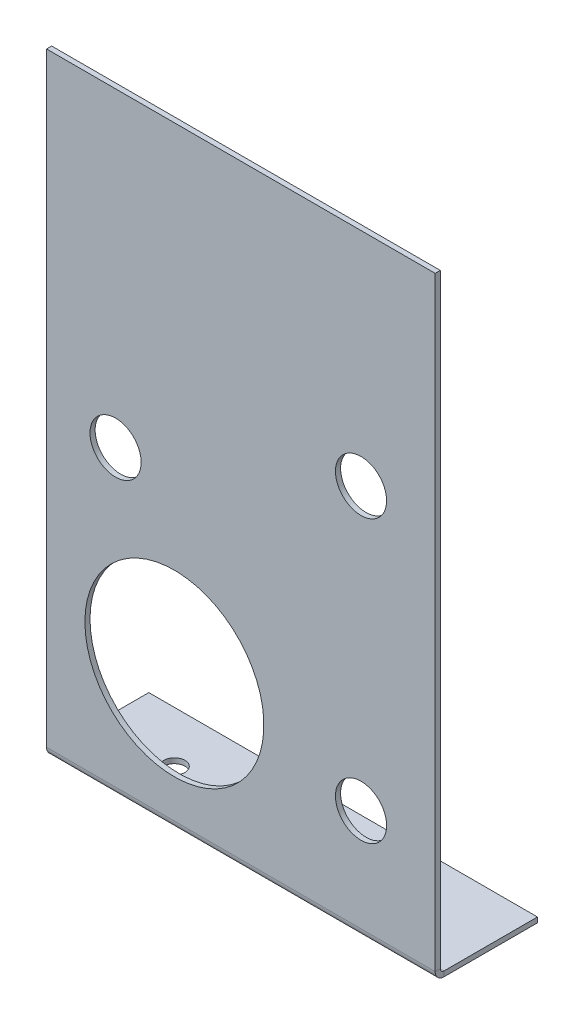
ISO-10303-21;
HEADER;
FILE_DESCRIPTION(('STEP AP214'),'2;1');
FILE_NAME('part.step','',(''),(''),'','','');
FILE_SCHEMA(('AUTOMOTIVE_DESIGN { 1 0 10303 214 1 1 1 1 }'));
ENDSEC;
DATA;
#1=APPLICATION_CONTEXT('core data for automotive mechanical design processes');
#2=APPLICATION_PROTOCOL_DEFINITION('international standard','automotive_design',2000,#1);
#3=PRODUCT_CONTEXT('',#1,'mechanical');
#4=PRODUCT('Part','Part','',(#3));
#5=PRODUCT_RELATED_PRODUCT_CATEGORY('part','',(#4));
#6=PRODUCT_DEFINITION_FORMATION('','',#4);
#7=PRODUCT_DEFINITION_CONTEXT('part definition',#1,'design');
#8=PRODUCT_DEFINITION('design','',#6,#7);
#9=PRODUCT_DEFINITION_SHAPE('','',#8);
#10=(LENGTH_UNIT() NAMED_UNIT(*) SI_UNIT(.MILLI.,.METRE.));
#11=(NAMED_UNIT(*) PLANE_ANGLE_UNIT() SI_UNIT($,.RADIAN.));
#12=(NAMED_UNIT(*) SI_UNIT($,.STERADIAN.) SOLID_ANGLE_UNIT());
#13=UNCERTAINTY_MEASURE_WITH_UNIT(LENGTH_MEASURE(1.E-05),#10,'distance_accuracy_value','');
#14=(GEOMETRIC_REPRESENTATION_CONTEXT(3) GLOBAL_UNCERTAINTY_ASSIGNED_CONTEXT((#13)) GLOBAL_UNIT_ASSIGNED_CONTEXT((#10,
#11,#12)) REPRESENTATION_CONTEXT('',''));
#15=CARTESIAN_POINT('',(0.,0.,0.));
#16=DIRECTION('',(0.,0.,1.));
#17=DIRECTION('',(1.,0.,0.));
#18=AXIS2_PLACEMENT_3D('',#15,#16,#17);
#19=CARTESIAN_POINT('',(-38.,-60.,-1.));
#20=DIRECTION('',(-1.,0.,0.));
#21=DIRECTION('',(0.,0.,1.));
#22=AXIS2_PLACEMENT_3D('',#19,#20,#21);
#23=PLANE('',#22);
#24=DIRECTION('',(0.,-1.,0.));
#25=VECTOR('',#24,1.);
#26=CARTESIAN_POINT('',(-38.,-60.,-1.));
#27=LINE('',#26,#25);
#28=CARTESIAN_POINT('',(-38.,60.,-1.));
#29=VERTEX_POINT('',#28);
#30=CARTESIAN_POINT('',(-38.,-58.2634,-1.));
#31=VERTEX_POINT('',#30);
#32=EDGE_CURVE('E242',#29,#31,#27,.T.);
#33=ORIENTED_EDGE('',*,*,#32,.T.);
#34=DIRECTION('',(0.,0.,1.));
#35=VECTOR('',#34,1.);
#36=CARTESIAN_POINT('',(-38.,-58.2634,-1.));
#37=LINE('',#36,#35);
#38=CARTESIAN_POINT('',(-38.,-58.2634,0.));
#39=VERTEX_POINT('',#38);
#40=EDGE_CURVE('E215',#31,#39,#37,.T.);
#41=ORIENTED_EDGE('',*,*,#40,.T.);
#42=DIRECTION('',(0.,-1.,0.));
#43=VECTOR('',#42,1.);
#44=CARTESIAN_POINT('',(-38.,-60.,0.));
#45=LINE('',#44,#43);
#46=CARTESIAN_POINT('',(-38.,60.,0.));
#47=VERTEX_POINT('',#46);
#48=EDGE_CURVE('E238',#47,#39,#45,.T.);
#49=ORIENTED_EDGE('',*,*,#48,.F.);
#50=DIRECTION('',(0.,0.,1.));
#51=VECTOR('',#50,1.);
#52=CARTESIAN_POINT('',(-38.,60.,-1.));
#53=LINE('',#52,#51);
#54=EDGE_CURVE('E14',#29,#47,#53,.T.);
#55=ORIENTED_EDGE('',*,*,#54,.F.);
#56=EDGE_LOOP('',(#33,#41,#49,#55));
#57=FACE_BOUND('',#56,.T.);
#58=ADVANCED_FACE('F70',(#57),#23,.T.);
#59=CARTESIAN_POINT('',(0.,0.,-1.));
#60=DIRECTION('',(0.,0.,-1.));
#61=DIRECTION('',(-1.,0.,0.));
#62=AXIS2_PLACEMENT_3D('',#59,#60,#61);
#63=PLANE('',#62);
#64=CARTESIAN_POINT('',(23.5,16.7366,-1.));
#65=DIRECTION('',(0.,0.,-1.));
#66=DIRECTION('',(-1.,0.,0.));
#67=AXIS2_PLACEMENT_3D('',#64,#65,#66);
#68=CIRCLE('',#67,5.);
#69=CARTESIAN_POINT('',(18.5,16.7366,-1.));
#70=VERTEX_POINT('',#69);
#71=EDGE_CURVE('E359',#70,#70,#68,.T.);
#72=ORIENTED_EDGE('',*,*,#71,.F.);
#73=EDGE_LOOP('',(#72));
#74=FACE_BOUND('',#73,.T.);
#75=CARTESIAN_POINT('',(-24.5,-0.763399999999977,-1.));
#76=DIRECTION('',(0.,0.,-1.));
#77=DIRECTION('',(-1.,0.,0.));
#78=AXIS2_PLACEMENT_3D('',#75,#76,#77);
#79=CIRCLE('',#78,5.);
#80=CARTESIAN_POINT('',(-29.5,-0.763399999999977,-1.));
#81=VERTEX_POINT('',#80);
#82=EDGE_CURVE('E365',#81,#81,#79,.T.);
#83=ORIENTED_EDGE('',*,*,#82,.F.);
#84=EDGE_LOOP('',(#83));
#85=FACE_BOUND('',#84,.T.);
#86=CARTESIAN_POINT('',(-13.,-33.2634,-1.));
#87=DIRECTION('',(0.,0.,-1.));
#88=DIRECTION('',(-1.,0.,0.));
#89=AXIS2_PLACEMENT_3D('',#86,#87,#88);
#90=CIRCLE('',#89,17.5);
#91=CARTESIAN_POINT('',(-30.5,-33.2634,-1.));
#92=VERTEX_POINT('',#91);
#93=EDGE_CURVE('E371',#92,#92,#90,.T.);
#94=ORIENTED_EDGE('',*,*,#93,.F.);
#95=EDGE_LOOP('',(#94));
#96=FACE_BOUND('',#95,.T.);
#97=CARTESIAN_POINT('',(23.5,-38.2634,-1.));
#98=DIRECTION('',(0.,0.,-1.));
#99=DIRECTION('',(-1.,0.,0.));
#100=AXIS2_PLACEMENT_3D('',#97,#98,#99);
#101=CIRCLE('',#100,5.);
#102=CARTESIAN_POINT('',(18.5,-38.2634,-1.));
#103=VERTEX_POINT('',#102);
#104=EDGE_CURVE('E287',#103,#103,#101,.T.);
#105=ORIENTED_EDGE('',*,*,#104,.F.);
#106=EDGE_LOOP('',(#105));
#107=FACE_BOUND('',#106,.T.);
#108=DIRECTION('',(0.,1.,0.));
#109=VECTOR('',#108,1.);
#110=CARTESIAN_POINT('',(38.,-60.,-1.));
#111=LINE('',#110,#109);
#112=CARTESIAN_POINT('',(38.,-58.2634,-1.));
#113=VERTEX_POINT('',#112);
#114=CARTESIAN_POINT('',(38.,60.,-1.));
#115=VERTEX_POINT('',#114);
#116=EDGE_CURVE('E234',#113,#115,#111,.T.);
#117=ORIENTED_EDGE('',*,*,#116,.F.);
#118=DIRECTION('',(-1.,0.,0.));
#119=VECTOR('',#118,1.);
#120=CARTESIAN_POINT('',(-38.,-58.2634,-1.));
#121=LINE('',#120,#119);
#122=EDGE_CURVE('E89',#31,#113,#121,.F.);
#123=ORIENTED_EDGE('',*,*,#122,.F.);
#124=ORIENTED_EDGE('',*,*,#32,.F.);
#125=DIRECTION('',(-1.,0.,0.));
#126=VECTOR('',#125,1.);
#127=CARTESIAN_POINT('',(-38.,60.,-1.));
#128=LINE('',#127,#126);
#129=EDGE_CURVE('E237',#115,#29,#128,.T.);
#130=ORIENTED_EDGE('',*,*,#129,.F.);
#131=EDGE_LOOP('',(#117,#123,#124,#130));
#132=FACE_BOUND('',#131,.T.);
#133=ADVANCED_FACE('F327',(#74,#85,#96,#107,#132),#63,.T.);
#134=CARTESIAN_POINT('',(0.,0.,0.));
#135=DIRECTION('',(0.,0.,-1.));
#136=DIRECTION('',(-1.,0.,0.));
#137=AXIS2_PLACEMENT_3D('',#134,#135,#136);
#138=PLANE('',#137);
#139=CARTESIAN_POINT('',(23.5,16.7366,0.));
#140=DIRECTION('',(0.,0.,-1.));
#141=DIRECTION('',(-1.,0.,0.));
#142=AXIS2_PLACEMENT_3D('',#139,#140,#141);
#143=CIRCLE('',#142,5.);
#144=CARTESIAN_POINT('',(18.5,16.7366,0.));
#145=VERTEX_POINT('',#144);
#146=EDGE_CURVE('E343',#145,#145,#143,.T.);
#147=ORIENTED_EDGE('',*,*,#146,.T.);
#148=EDGE_LOOP('',(#147));
#149=FACE_BOUND('',#148,.T.);
#150=CARTESIAN_POINT('',(-24.5,-0.763399999999977,0.));
#151=DIRECTION('',(0.,0.,-1.));
#152=DIRECTION('',(-1.,0.,0.));
#153=AXIS2_PLACEMENT_3D('',#150,#151,#152);
#154=CIRCLE('',#153,5.);
#155=CARTESIAN_POINT('',(-29.5,-0.763399999999977,0.));
#156=VERTEX_POINT('',#155);
#157=EDGE_CURVE('E347',#156,#156,#154,.T.);
#158=ORIENTED_EDGE('',*,*,#157,.T.);
#159=EDGE_LOOP('',(#158));
#160=FACE_BOUND('',#159,.T.);
#161=CARTESIAN_POINT('',(-13.,-33.2634,0.));
#162=DIRECTION('',(0.,0.,-1.));
#163=DIRECTION('',(-1.,0.,0.));
#164=AXIS2_PLACEMENT_3D('',#161,#162,#163);
#165=CIRCLE('',#164,17.5);
#166=CARTESIAN_POINT('',(-30.5,-33.2634,0.));
#167=VERTEX_POINT('',#166);
#168=EDGE_CURVE('E351',#167,#167,#165,.T.);
#169=ORIENTED_EDGE('',*,*,#168,.T.);
#170=EDGE_LOOP('',(#169));
#171=FACE_BOUND('',#170,.T.);
#172=CARTESIAN_POINT('',(23.5,-38.2634,0.));
#173=DIRECTION('',(0.,0.,-1.));
#174=DIRECTION('',(-1.,0.,0.));
#175=AXIS2_PLACEMENT_3D('',#172,#173,#174);
#176=CIRCLE('',#175,5.);
#177=CARTESIAN_POINT('',(18.5,-38.2634,0.));
#178=VERTEX_POINT('',#177);
#179=EDGE_CURVE('E277',#178,#178,#176,.T.);
#180=ORIENTED_EDGE('',*,*,#179,.T.);
#181=EDGE_LOOP('',(#180));
#182=FACE_BOUND('',#181,.T.);
#183=DIRECTION('',(-1.,0.,0.));
#184=VECTOR('',#183,1.);
#185=CARTESIAN_POINT('',(-38.,-58.2634,0.));
#186=LINE('',#185,#184);
#187=CARTESIAN_POINT('',(38.,-58.2634,0.));
#188=VERTEX_POINT('',#187);
#189=EDGE_CURVE('E207',#39,#188,#186,.F.);
#190=ORIENTED_EDGE('',*,*,#189,.T.);
#191=DIRECTION('',(0.,1.,0.));
#192=VECTOR('',#191,1.);
#193=CARTESIAN_POINT('',(38.,-60.,0.));
#194=LINE('',#193,#192);
#195=CARTESIAN_POINT('',(38.,60.,0.));
#196=VERTEX_POINT('',#195);
#197=EDGE_CURVE('E231',#188,#196,#194,.T.);
#198=ORIENTED_EDGE('',*,*,#197,.T.);
#199=DIRECTION('',(-1.,0.,0.));
#200=VECTOR('',#199,1.);
#201=CARTESIAN_POINT('',(-38.,60.,0.));
#202=LINE('',#201,#200);
#203=EDGE_CURVE('E247',#196,#47,#202,.T.);
#204=ORIENTED_EDGE('',*,*,#203,.T.);
#205=ORIENTED_EDGE('',*,*,#48,.T.);
#206=EDGE_LOOP('',(#190,#198,#204,#205));
#207=FACE_BOUND('',#206,.T.);
#208=ADVANCED_FACE('F256',(#149,#160,#171,#182,#207),#138,.F.);
#209=CARTESIAN_POINT('',(38.,-60.,-1.));
#210=DIRECTION('',(1.,0.,0.));
#211=DIRECTION('',(0.,0.,-1.));
#212=AXIS2_PLACEMENT_3D('',#209,#210,#211);
#213=PLANE('',#212);
#214=DIRECTION('',(0.,0.,1.));
#215=VECTOR('',#214,1.);
#216=CARTESIAN_POINT('',(38.,-58.2634,-1.));
#217=LINE('',#216,#215);
#218=EDGE_CURVE('E98',#113,#188,#217,.T.);
#219=ORIENTED_EDGE('',*,*,#218,.F.);
#220=ORIENTED_EDGE('',*,*,#116,.T.);
#221=DIRECTION('',(0.,0.,1.));
#222=VECTOR('',#221,1.);
#223=CARTESIAN_POINT('',(38.,60.,-1.));
#224=LINE('',#223,#222);
#225=EDGE_CURVE('E74',#115,#196,#224,.T.);
#226=ORIENTED_EDGE('',*,*,#225,.T.);
#227=ORIENTED_EDGE('',*,*,#197,.F.);
#228=EDGE_LOOP('',(#219,#220,#226,#227));
#229=FACE_BOUND('',#228,.T.);
#230=ADVANCED_FACE('F72',(#229),#213,.T.);
#231=CARTESIAN_POINT('',(-38.,60.,-1.));
#232=DIRECTION('',(0.,1.,0.));
#233=DIRECTION('',(0.,0.,1.));
#234=AXIS2_PLACEMENT_3D('',#231,#232,#233);
#235=PLANE('',#234);
#236=ORIENTED_EDGE('',*,*,#203,.F.);
#237=ORIENTED_EDGE('',*,*,#225,.F.);
#238=ORIENTED_EDGE('',*,*,#129,.T.);
#239=ORIENTED_EDGE('',*,*,#54,.T.);
#240=EDGE_LOOP('',(#236,#237,#238,#239));
#241=FACE_BOUND('',#240,.T.);
#242=ADVANCED_FACE('F317',(#241),#235,.T.);
#243=CARTESIAN_POINT('',(38.,-58.2634,-1.7366));
#244=DIRECTION('',(1.,0.,0.));
#245=DIRECTION('',(0.,0.,-1.));
#246=AXIS2_PLACEMENT_3D('',#243,#244,#245);
#247=PLANE('',#246);
#248=DIRECTION('',(0.,1.,0.));
#249=VECTOR('',#248,1.);
#250=CARTESIAN_POINT('',(38.,-60.,-1.73659999999999));
#251=LINE('',#250,#249);
#252=CARTESIAN_POINT('',(38.,-59.,-1.7366));
#253=VERTEX_POINT('',#252);
#254=CARTESIAN_POINT('',(37.9999999999999,-60.,-1.73659999999999));
#255=VERTEX_POINT('',#254);
#256=EDGE_CURVE('E179',#253,#255,#251,.F.);
#257=ORIENTED_EDGE('',*,*,#256,.F.);
#258=CARTESIAN_POINT('',(38.,-58.2634,-1.7366));
#259=DIRECTION('',(-1.,0.,0.));
#260=DIRECTION('',(0.,0.,1.));
#261=AXIS2_PLACEMENT_3D('',#258,#259,#260);
#262=CIRCLE('',#261,0.736599999999997);
#263=EDGE_CURVE('E219',#113,#253,#262,.F.);
#264=ORIENTED_EDGE('',*,*,#263,.F.);
#265=ORIENTED_EDGE('',*,*,#218,.T.);
#266=CARTESIAN_POINT('',(37.9999999999999,-58.2634,-1.7366));
#267=DIRECTION('',(-1.,0.,0.));
#268=DIRECTION('',(0.,0.,1.));
#269=AXIS2_PLACEMENT_3D('',#266,#267,#268);
#270=CIRCLE('',#269,1.7366);
#271=EDGE_CURVE('E210',#188,#255,#270,.F.);
#272=ORIENTED_EDGE('',*,*,#271,.T.);
#273=EDGE_LOOP('',(#257,#264,#265,#272));
#274=FACE_BOUND('',#273,.T.);
#275=ADVANCED_FACE('F315',(#274),#247,.T.);
#276=CARTESIAN_POINT('',(-38.,-58.2634,-1.7366));
#277=DIRECTION('',(1.,0.,0.));
#278=DIRECTION('',(0.,0.,-1.));
#279=AXIS2_PLACEMENT_3D('',#276,#277,#278);
#280=PLANE('',#279);
#281=CARTESIAN_POINT('',(-38.,-58.2634,-1.7366));
#282=DIRECTION('',(-1.,0.,0.));
#283=DIRECTION('',(0.,0.,1.));
#284=AXIS2_PLACEMENT_3D('',#281,#282,#283);
#285=CIRCLE('',#284,0.736599999999997);
#286=CARTESIAN_POINT('',(-38.,-59.,-1.7366));
#287=VERTEX_POINT('',#286);
#288=EDGE_CURVE('E225',#287,#31,#285,.T.);
#289=ORIENTED_EDGE('',*,*,#288,.F.);
#290=DIRECTION('',(0.,1.,0.));
#291=VECTOR('',#290,1.);
#292=CARTESIAN_POINT('',(-38.,-59.,-1.7366));
#293=LINE('',#292,#291);
#294=CARTESIAN_POINT('',(-38.,-60.,-1.73659999999999));
#295=VERTEX_POINT('',#294);
#296=EDGE_CURVE('E197',#287,#295,#293,.F.);
#297=ORIENTED_EDGE('',*,*,#296,.T.);
#298=CARTESIAN_POINT('',(-38.,-58.2634,-1.7366));
#299=DIRECTION('',(-1.,0.,0.));
#300=DIRECTION('',(0.,0.,1.));
#301=AXIS2_PLACEMENT_3D('',#298,#299,#300);
#302=CIRCLE('',#301,1.7366);
#303=EDGE_CURVE('E211',#295,#39,#302,.T.);
#304=ORIENTED_EDGE('',*,*,#303,.T.);
#305=ORIENTED_EDGE('',*,*,#40,.F.);
#306=EDGE_LOOP('',(#289,#297,#304,#305));
#307=FACE_BOUND('',#306,.T.);
#308=ADVANCED_FACE('F265',(#307),#280,.F.);
#309=CARTESIAN_POINT('',(-38.,-58.2634,-1.7366));
#310=DIRECTION('',(-1.,0.,0.));
#311=DIRECTION('',(0.,-1.,0.));
#312=AXIS2_PLACEMENT_3D('',#309,#310,#311);
#313=CYLINDRICAL_SURFACE('',#312,1.7366);
#314=ORIENTED_EDGE('',*,*,#189,.F.);
#315=ORIENTED_EDGE('',*,*,#303,.F.);
#316=DIRECTION('',(-1.,0.,0.));
#317=VECTOR('',#316,1.);
#318=CARTESIAN_POINT('',(38.,-60.,-1.73659999999999));
#319=LINE('',#318,#317);
#320=EDGE_CURVE('E194',#295,#255,#319,.F.);
#321=ORIENTED_EDGE('',*,*,#320,.T.);
#322=ORIENTED_EDGE('',*,*,#271,.F.);
#323=EDGE_LOOP('',(#314,#315,#321,#322));
#324=FACE_BOUND('',#323,.T.);
#325=ADVANCED_FACE('F261',(#324),#313,.T.);
#326=CARTESIAN_POINT('',(-38.,-58.2634,-1.7366));
#327=DIRECTION('',(-1.,0.,0.));
#328=DIRECTION('',(0.,-1.,0.));
#329=AXIS2_PLACEMENT_3D('',#326,#327,#328);
#330=CYLINDRICAL_SURFACE('',#329,0.736599999999997);
#331=ORIENTED_EDGE('',*,*,#122,.T.);
#332=ORIENTED_EDGE('',*,*,#263,.T.);
#333=DIRECTION('',(-1.,0.,0.));
#334=VECTOR('',#333,1.);
#335=CARTESIAN_POINT('',(38.,-59.,-1.7366));
#336=LINE('',#335,#334);
#337=EDGE_CURVE('E201',#253,#287,#336,.T.);
#338=ORIENTED_EDGE('',*,*,#337,.T.);
#339=ORIENTED_EDGE('',*,*,#288,.T.);
#340=EDGE_LOOP('',(#331,#332,#338,#339));
#341=FACE_BOUND('',#340,.T.);
#342=ADVANCED_FACE('F312',(#341),#330,.F.);
#343=CARTESIAN_POINT('',(-38.,-60.,-20.));
#344=DIRECTION('',(1.,0.,0.));
#345=DIRECTION('',(0.,0.,-1.));
#346=AXIS2_PLACEMENT_3D('',#343,#344,#345);
#347=PLANE('',#346);
#348=ORIENTED_EDGE('',*,*,#296,.F.);
#349=DIRECTION('',(0.,0.,1.));
#350=VECTOR('',#349,1.);
#351=CARTESIAN_POINT('',(-38.,-59.,-20.));
#352=LINE('',#351,#350);
#353=CARTESIAN_POINT('',(-38.,-59.,-20.));
#354=VERTEX_POINT('',#353);
#355=EDGE_CURVE('E191',#287,#354,#352,.F.);
#356=ORIENTED_EDGE('',*,*,#355,.T.);
#357=DIRECTION('',(0.,1.,0.));
#358=VECTOR('',#357,1.);
#359=CARTESIAN_POINT('',(-38.,-60.,-20.));
#360=LINE('',#359,#358);
#361=CARTESIAN_POINT('',(-38.,-60.,-20.));
#362=VERTEX_POINT('',#361);
#363=EDGE_CURVE('E175',#362,#354,#360,.T.);
#364=ORIENTED_EDGE('',*,*,#363,.F.);
#365=DIRECTION('',(0.,0.,-1.));
#366=VECTOR('',#365,1.);
#367=CARTESIAN_POINT('',(-38.,-60.,2.08736658917573E-13));
#368=LINE('',#367,#366);
#369=EDGE_CURVE('E160',#295,#362,#368,.T.);
#370=ORIENTED_EDGE('',*,*,#369,.F.);
#371=EDGE_LOOP('',(#348,#356,#364,#370));
#372=FACE_BOUND('',#371,.T.);
#373=ADVANCED_FACE('F269',(#372),#347,.F.);
#374=CARTESIAN_POINT('',(38.,-60.,-0.999999999999997));
#375=DIRECTION('',(-1.,0.,0.));
#376=DIRECTION('',(0.,0.,1.));
#377=AXIS2_PLACEMENT_3D('',#374,#375,#376);
#378=PLANE('',#377);
#379=ORIENTED_EDGE('',*,*,#256,.T.);
#380=DIRECTION('',(0.,0.,1.));
#381=VECTOR('',#380,1.);
#382=CARTESIAN_POINT('',(38.,-60.,2.36492234533202E-13));
#383=LINE('',#382,#381);
#384=CARTESIAN_POINT('',(38.,-60.,-20.));
#385=VERTEX_POINT('',#384);
#386=EDGE_CURVE('E158',#385,#255,#383,.T.);
#387=ORIENTED_EDGE('',*,*,#386,.F.);
#388=DIRECTION('',(0.,1.,0.));
#389=VECTOR('',#388,1.);
#390=CARTESIAN_POINT('',(38.,-60.,-20.));
#391=LINE('',#390,#389);
#392=CARTESIAN_POINT('',(38.,-59.,-20.));
#393=VERTEX_POINT('',#392);
#394=EDGE_CURVE('E167',#385,#393,#391,.T.);
#395=ORIENTED_EDGE('',*,*,#394,.T.);
#396=DIRECTION('',(0.,0.,-1.));
#397=VECTOR('',#396,1.);
#398=CARTESIAN_POINT('',(38.,-59.,-1.));
#399=LINE('',#398,#397);
#400=EDGE_CURVE('E186',#393,#253,#399,.F.);
#401=ORIENTED_EDGE('',*,*,#400,.T.);
#402=EDGE_LOOP('',(#379,#387,#395,#401));
#403=FACE_BOUND('',#402,.T.);
#404=ADVANCED_FACE('F178',(#403),#378,.F.);
#405=CARTESIAN_POINT('',(0.,-60.,2.22614446725387E-13));
#406=DIRECTION('',(0.,1.,0.));
#407=DIRECTION('',(0.,0.,1.));
#408=AXIS2_PLACEMENT_3D('',#405,#406,#407);
#409=PLANE('',#408);
#410=CARTESIAN_POINT('',(-23.,-60.,-9.99999999999997));
#411=DIRECTION('',(0.,1.,0.));
#412=DIRECTION('',(0.,0.,1.));
#413=AXIS2_PLACEMENT_3D('',#410,#411,#412);
#414=CIRCLE('',#413,2.06399442875174);
#415=CARTESIAN_POINT('',(-23.,-60.,-7.93600557124823));
#416=VERTEX_POINT('',#415);
#417=EDGE_CURVE('E206',#416,#416,#414,.T.);
#418=ORIENTED_EDGE('',*,*,#417,.T.);
#419=EDGE_LOOP('',(#418));
#420=FACE_BOUND('',#419,.T.);
#421=CARTESIAN_POINT('',(23.,-60.,-9.99999999999997));
#422=DIRECTION('',(0.,1.,0.));
#423=DIRECTION('',(0.,0.,1.));
#424=AXIS2_PLACEMENT_3D('',#421,#422,#423);
#425=CIRCLE('',#424,2.06399442875174);
#426=CARTESIAN_POINT('',(23.,-60.,-7.93600557124823));
#427=VERTEX_POINT('',#426);
#428=EDGE_CURVE('E276',#427,#427,#425,.T.);
#429=ORIENTED_EDGE('',*,*,#428,.T.);
#430=EDGE_LOOP('',(#429));
#431=FACE_BOUND('',#430,.T.);
#432=ORIENTED_EDGE('',*,*,#320,.F.);
#433=ORIENTED_EDGE('',*,*,#369,.T.);
#434=DIRECTION('',(1.,0.,0.));
#435=VECTOR('',#434,1.);
#436=CARTESIAN_POINT('',(0.,-60.,-20.));
#437=LINE('',#436,#435);
#438=EDGE_CURVE('E153',#362,#385,#437,.T.);
#439=ORIENTED_EDGE('',*,*,#438,.T.);
#440=ORIENTED_EDGE('',*,*,#386,.T.);
#441=EDGE_LOOP('',(#432,#433,#439,#440));
#442=FACE_BOUND('',#441,.T.);
#443=ADVANCED_FACE('F156',(#420,#431,#442),#409,.F.);
#444=CARTESIAN_POINT('',(0.,-59.,2.19122965386544E-13));
#445=DIRECTION('',(0.,1.,0.));
#446=DIRECTION('',(0.,0.,1.));
#447=AXIS2_PLACEMENT_3D('',#444,#445,#446);
#448=PLANE('',#447);
#449=CARTESIAN_POINT('',(-23.,-59.,-9.99999999999997));
#450=DIRECTION('',(0.,1.,0.));
#451=DIRECTION('',(0.,0.,1.));
#452=AXIS2_PLACEMENT_3D('',#449,#450,#451);
#453=CIRCLE('',#452,2.06399442875174);
#454=CARTESIAN_POINT('',(-23.,-59.,-7.93600557124823));
#455=VERTEX_POINT('',#454);
#456=EDGE_CURVE('E286',#455,#455,#453,.T.);
#457=ORIENTED_EDGE('',*,*,#456,.F.);
#458=EDGE_LOOP('',(#457));
#459=FACE_BOUND('',#458,.T.);
#460=CARTESIAN_POINT('',(23.,-59.,-9.99999999999997));
#461=DIRECTION('',(0.,1.,0.));
#462=DIRECTION('',(0.,0.,1.));
#463=AXIS2_PLACEMENT_3D('',#460,#461,#462);
#464=CIRCLE('',#463,2.06399442875174);
#465=CARTESIAN_POINT('',(23.,-59.,-7.93600557124823));
#466=VERTEX_POINT('',#465);
#467=EDGE_CURVE('E272',#466,#466,#464,.T.);
#468=ORIENTED_EDGE('',*,*,#467,.F.);
#469=EDGE_LOOP('',(#468));
#470=FACE_BOUND('',#469,.T.);
#471=ORIENTED_EDGE('',*,*,#355,.F.);
#472=ORIENTED_EDGE('',*,*,#337,.F.);
#473=ORIENTED_EDGE('',*,*,#400,.F.);
#474=DIRECTION('',(-1.,0.,0.));
#475=VECTOR('',#474,1.);
#476=CARTESIAN_POINT('',(38.,-59.,-20.));
#477=LINE('',#476,#475);
#478=EDGE_CURVE('E170',#354,#393,#477,.F.);
#479=ORIENTED_EDGE('',*,*,#478,.F.);
#480=EDGE_LOOP('',(#471,#472,#473,#479));
#481=FACE_BOUND('',#480,.T.);
#482=ADVANCED_FACE('F305',(#459,#470,#481),#448,.T.);
#483=CARTESIAN_POINT('',(38.,-60.,-20.));
#484=DIRECTION('',(0.,0.,1.));
#485=DIRECTION('',(0.,-1.,0.));
#486=AXIS2_PLACEMENT_3D('',#483,#484,#485);
#487=PLANE('',#486);
#488=ORIENTED_EDGE('',*,*,#478,.T.);
#489=ORIENTED_EDGE('',*,*,#394,.F.);
#490=ORIENTED_EDGE('',*,*,#438,.F.);
#491=ORIENTED_EDGE('',*,*,#363,.T.);
#492=EDGE_LOOP('',(#488,#489,#490,#491));
#493=FACE_BOUND('',#492,.T.);
#494=ADVANCED_FACE('F168',(#493),#487,.F.);
#495=CARTESIAN_POINT('',(23.,-60.,-9.99999999999997));
#496=DIRECTION('',(0.,1.,0.));
#497=DIRECTION('',(0.,0.,1.));
#498=AXIS2_PLACEMENT_3D('',#495,#496,#497);
#499=CYLINDRICAL_SURFACE('',#498,2.06399442875174);
#500=ORIENTED_EDGE('',*,*,#428,.F.);
#501=EDGE_LOOP('',(#500));
#502=FACE_BOUND('',#501,.T.);
#503=ORIENTED_EDGE('',*,*,#467,.T.);
#504=EDGE_LOOP('',(#503));
#505=FACE_BOUND('',#504,.T.);
#506=ADVANCED_FACE('F298',(#502,#505),#499,.F.);
#507=CARTESIAN_POINT('',(-23.,-60.,-9.99999999999997));
#508=DIRECTION('',(0.,1.,0.));
#509=DIRECTION('',(0.,0.,1.));
#510=AXIS2_PLACEMENT_3D('',#507,#508,#509);
#511=CYLINDRICAL_SURFACE('',#510,2.06399442875174);
#512=ORIENTED_EDGE('',*,*,#417,.F.);
#513=EDGE_LOOP('',(#512));
#514=FACE_BOUND('',#513,.T.);
#515=ORIENTED_EDGE('',*,*,#456,.T.);
#516=EDGE_LOOP('',(#515));
#517=FACE_BOUND('',#516,.T.);
#518=ADVANCED_FACE('F301',(#514,#517),#511,.F.);
#519=CARTESIAN_POINT('',(23.5,-38.2634,0.));
#520=DIRECTION('',(0.,0.,-1.));
#521=DIRECTION('',(-1.,0.,0.));
#522=AXIS2_PLACEMENT_3D('',#519,#520,#521);
#523=CYLINDRICAL_SURFACE('',#522,5.);
#524=ORIENTED_EDGE('',*,*,#179,.F.);
#525=EDGE_LOOP('',(#524));
#526=FACE_BOUND('',#525,.T.);
#527=ORIENTED_EDGE('',*,*,#104,.T.);
#528=EDGE_LOOP('',(#527));
#529=FACE_BOUND('',#528,.T.);
#530=ADVANCED_FACE('F387',(#526,#529),#523,.F.);
#531=CARTESIAN_POINT('',(-13.,-33.2634,0.));
#532=DIRECTION('',(0.,0.,-1.));
#533=DIRECTION('',(-1.,0.,0.));
#534=AXIS2_PLACEMENT_3D('',#531,#532,#533);
#535=CYLINDRICAL_SURFACE('',#534,17.5);
#536=ORIENTED_EDGE('',*,*,#168,.F.);
#537=EDGE_LOOP('',(#536));
#538=FACE_BOUND('',#537,.T.);
#539=ORIENTED_EDGE('',*,*,#93,.T.);
#540=EDGE_LOOP('',(#539));
#541=FACE_BOUND('',#540,.T.);
#542=ADVANCED_FACE('F378',(#538,#541),#535,.F.);
#543=CARTESIAN_POINT('',(-24.5,-0.763399999999977,0.));
#544=DIRECTION('',(0.,0.,-1.));
#545=DIRECTION('',(-1.,0.,0.));
#546=AXIS2_PLACEMENT_3D('',#543,#544,#545);
#547=CYLINDRICAL_SURFACE('',#546,5.);
#548=ORIENTED_EDGE('',*,*,#157,.F.);
#549=EDGE_LOOP('',(#548));
#550=FACE_BOUND('',#549,.T.);
#551=ORIENTED_EDGE('',*,*,#82,.T.);
#552=EDGE_LOOP('',(#551));
#553=FACE_BOUND('',#552,.T.);
#554=ADVANCED_FACE('F394',(#550,#553),#547,.F.);
#555=CARTESIAN_POINT('',(23.5,16.7366,0.));
#556=DIRECTION('',(0.,0.,-1.));
#557=DIRECTION('',(-1.,0.,0.));
#558=AXIS2_PLACEMENT_3D('',#555,#556,#557);
#559=CYLINDRICAL_SURFACE('',#558,5.);
#560=ORIENTED_EDGE('',*,*,#146,.F.);
#561=EDGE_LOOP('',(#560));
#562=FACE_BOUND('',#561,.T.);
#563=ORIENTED_EDGE('',*,*,#71,.T.);
#564=EDGE_LOOP('',(#563));
#565=FACE_BOUND('',#564,.T.);
#566=ADVANCED_FACE('F400',(#562,#565),#559,.F.);
#567=CLOSED_SHELL('',(#58,#133,#208,#230,#242,#275,#308,#325,#342,#373,#404,#443,#482,#494,#506,
#518,#530,#542,#554,#566));
#568=MANIFOLD_SOLID_BREP('B2',#567);
#569=ADVANCED_BREP_SHAPE_REPRESENTATION('',(#18,#568),#14);
#570=SHAPE_DEFINITION_REPRESENTATION(#9,#569);
ENDSEC;
END-ISO-10303-21;
